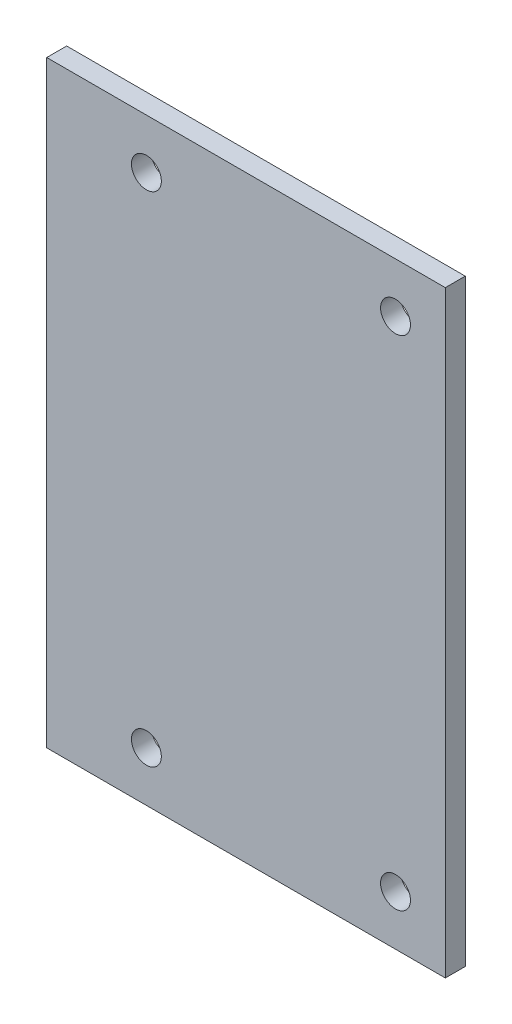
ISO-10303-21;
HEADER;
FILE_DESCRIPTION(('STEP AP214'),'2;1');
FILE_NAME('part.step','',(''),(''),'','','');
FILE_SCHEMA(('AUTOMOTIVE_DESIGN { 1 0 10303 214 1 1 1 1 }'));
ENDSEC;
DATA;
#1=APPLICATION_CONTEXT('core data for automotive mechanical design processes');
#2=APPLICATION_PROTOCOL_DEFINITION('international standard','automotive_design',2000,#1);
#3=PRODUCT_CONTEXT('',#1,'mechanical');
#4=PRODUCT('Part','Part','',(#3));
#5=PRODUCT_RELATED_PRODUCT_CATEGORY('part','',(#4));
#6=PRODUCT_DEFINITION_FORMATION('','',#4);
#7=PRODUCT_DEFINITION_CONTEXT('part definition',#1,'design');
#8=PRODUCT_DEFINITION('design','',#6,#7);
#9=PRODUCT_DEFINITION_SHAPE('','',#8);
#10=(LENGTH_UNIT() NAMED_UNIT(*) SI_UNIT(.MILLI.,.METRE.));
#11=(NAMED_UNIT(*) PLANE_ANGLE_UNIT() SI_UNIT($,.RADIAN.));
#12=(NAMED_UNIT(*) SI_UNIT($,.STERADIAN.) SOLID_ANGLE_UNIT());
#13=UNCERTAINTY_MEASURE_WITH_UNIT(LENGTH_MEASURE(1.E-05),#10,'distance_accuracy_value','');
#14=(GEOMETRIC_REPRESENTATION_CONTEXT(3) GLOBAL_UNCERTAINTY_ASSIGNED_CONTEXT((#13)) GLOBAL_UNIT_ASSIGNED_CONTEXT((#10,
#11,#12)) REPRESENTATION_CONTEXT('',''));
#15=CARTESIAN_POINT('',(0.,0.,0.));
#16=DIRECTION('',(0.,0.,1.));
#17=DIRECTION('',(1.,0.,0.));
#18=AXIS2_PLACEMENT_3D('',#15,#16,#17);
#19=CARTESIAN_POINT('',(0.,0.,2.));
#20=DIRECTION('',(0.,0.,-1.));
#21=DIRECTION('',(-1.,0.,0.));
#22=AXIS2_PLACEMENT_3D('',#19,#20,#21);
#23=PLANE('',#22);
#24=CARTESIAN_POINT('',(10.,4.99999999999999,2.));
#25=DIRECTION('',(0.,0.,1.));
#26=DIRECTION('',(-1.,0.,0.));
#27=AXIS2_PLACEMENT_3D('',#24,#25,#26);
#28=CIRCLE('',#27,1.5);
#29=CARTESIAN_POINT('',(8.5,4.99999999999999,2.));
#30=VERTEX_POINT('',#29);
#31=EDGE_CURVE('E122',#30,#30,#28,.T.);
#32=ORIENTED_EDGE('',*,*,#31,.F.);
#33=EDGE_LOOP('',(#32));
#34=FACE_BOUND('',#33,.T.);
#35=CARTESIAN_POINT('',(10.,55.,2.));
#36=DIRECTION('',(0.,0.,1.));
#37=DIRECTION('',(1.,0.,0.));
#38=AXIS2_PLACEMENT_3D('',#35,#36,#37);
#39=CIRCLE('',#38,1.5);
#40=CARTESIAN_POINT('',(11.5,55.,2.));
#41=VERTEX_POINT('',#40);
#42=EDGE_CURVE('E101',#41,#41,#39,.T.);
#43=ORIENTED_EDGE('',*,*,#42,.F.);
#44=EDGE_LOOP('',(#43));
#45=FACE_BOUND('',#44,.T.);
#46=DIRECTION('',(0.,-1.,0.));
#47=VECTOR('',#46,1.);
#48=CARTESIAN_POINT('',(0.,0.,2.));
#49=LINE('',#48,#47);
#50=CARTESIAN_POINT('',(0.,60.,2.));
#51=VERTEX_POINT('',#50);
#52=CARTESIAN_POINT('',(0.,0.,2.));
#53=VERTEX_POINT('',#52);
#54=EDGE_CURVE('E86',#51,#53,#49,.T.);
#55=ORIENTED_EDGE('',*,*,#54,.T.);
#56=DIRECTION('',(1.,0.,0.));
#57=VECTOR('',#56,1.);
#58=CARTESIAN_POINT('',(0.,0.,2.));
#59=LINE('',#58,#57);
#60=CARTESIAN_POINT('',(40.,0.,2.));
#61=VERTEX_POINT('',#60);
#62=EDGE_CURVE('E81',#53,#61,#59,.T.);
#63=ORIENTED_EDGE('',*,*,#62,.T.);
#64=DIRECTION('',(0.,1.,0.));
#65=VECTOR('',#64,1.);
#66=CARTESIAN_POINT('',(40.,0.,2.));
#67=LINE('',#66,#65);
#68=CARTESIAN_POINT('',(40.,60.,2.));
#69=VERTEX_POINT('',#68);
#70=EDGE_CURVE('E84',#61,#69,#67,.T.);
#71=ORIENTED_EDGE('',*,*,#70,.T.);
#72=DIRECTION('',(-1.,0.,0.));
#73=VECTOR('',#72,1.);
#74=CARTESIAN_POINT('',(0.,60.,2.));
#75=LINE('',#74,#73);
#76=EDGE_CURVE('E51',#69,#51,#75,.T.);
#77=ORIENTED_EDGE('',*,*,#76,.T.);
#78=EDGE_LOOP('',(#55,#63,#71,#77));
#79=FACE_BOUND('',#78,.T.);
#80=CARTESIAN_POINT('',(35.,55.,2.));
#81=DIRECTION('',(0.,0.,1.));
#82=DIRECTION('',(1.,0.,0.));
#83=AXIS2_PLACEMENT_3D('',#80,#81,#82);
#84=CIRCLE('',#83,1.5);
#85=CARTESIAN_POINT('',(36.5,55.,2.));
#86=VERTEX_POINT('',#85);
#87=EDGE_CURVE('E116',#86,#86,#84,.T.);
#88=ORIENTED_EDGE('',*,*,#87,.F.);
#89=EDGE_LOOP('',(#88));
#90=FACE_BOUND('',#89,.T.);
#91=CARTESIAN_POINT('',(35.,4.99999999999999,2.));
#92=DIRECTION('',(0.,0.,1.));
#93=DIRECTION('',(-1.,0.,0.));
#94=AXIS2_PLACEMENT_3D('',#91,#92,#93);
#95=CIRCLE('',#94,1.5);
#96=CARTESIAN_POINT('',(33.5,4.99999999999999,2.));
#97=VERTEX_POINT('',#96);
#98=EDGE_CURVE('E128',#97,#97,#95,.T.);
#99=ORIENTED_EDGE('',*,*,#98,.F.);
#100=EDGE_LOOP('',(#99));
#101=FACE_BOUND('',#100,.T.);
#102=ADVANCED_FACE('F34',(#34,#45,#79,#90,#101),#23,.F.);
#103=CARTESIAN_POINT('',(0.,0.,0.));
#104=DIRECTION('',(0.,0.,-1.));
#105=DIRECTION('',(-1.,0.,0.));
#106=AXIS2_PLACEMENT_3D('',#103,#104,#105);
#107=PLANE('',#106);
#108=CARTESIAN_POINT('',(10.,4.99999999999999,0.));
#109=DIRECTION('',(0.,0.,1.));
#110=DIRECTION('',(-1.,0.,0.));
#111=AXIS2_PLACEMENT_3D('',#108,#109,#110);
#112=CIRCLE('',#111,1.5);
#113=CARTESIAN_POINT('',(8.5,4.99999999999999,0.));
#114=VERTEX_POINT('',#113);
#115=EDGE_CURVE('E125',#114,#114,#112,.T.);
#116=ORIENTED_EDGE('',*,*,#115,.T.);
#117=EDGE_LOOP('',(#116));
#118=FACE_BOUND('',#117,.T.);
#119=CARTESIAN_POINT('',(10.,55.,0.));
#120=DIRECTION('',(0.,0.,1.));
#121=DIRECTION('',(1.,0.,0.));
#122=AXIS2_PLACEMENT_3D('',#119,#120,#121);
#123=CIRCLE('',#122,1.5);
#124=CARTESIAN_POINT('',(11.5,55.,0.));
#125=VERTEX_POINT('',#124);
#126=EDGE_CURVE('E113',#125,#125,#123,.T.);
#127=ORIENTED_EDGE('',*,*,#126,.T.);
#128=EDGE_LOOP('',(#127));
#129=FACE_BOUND('',#128,.T.);
#130=DIRECTION('',(0.,-1.,0.));
#131=VECTOR('',#130,1.);
#132=CARTESIAN_POINT('',(0.,0.,0.));
#133=LINE('',#132,#131);
#134=CARTESIAN_POINT('',(0.,60.,0.));
#135=VERTEX_POINT('',#134);
#136=CARTESIAN_POINT('',(0.,0.,0.));
#137=VERTEX_POINT('',#136);
#138=EDGE_CURVE('E98',#135,#137,#133,.T.);
#139=ORIENTED_EDGE('',*,*,#138,.F.);
#140=DIRECTION('',(-1.,0.,0.));
#141=VECTOR('',#140,1.);
#142=CARTESIAN_POINT('',(0.,60.,0.));
#143=LINE('',#142,#141);
#144=CARTESIAN_POINT('',(40.,60.,0.));
#145=VERTEX_POINT('',#144);
#146=EDGE_CURVE('E74',#145,#135,#143,.T.);
#147=ORIENTED_EDGE('',*,*,#146,.F.);
#148=DIRECTION('',(0.,1.,0.));
#149=VECTOR('',#148,1.);
#150=CARTESIAN_POINT('',(40.,0.,0.));
#151=LINE('',#150,#149);
#152=CARTESIAN_POINT('',(40.,0.,0.));
#153=VERTEX_POINT('',#152);
#154=EDGE_CURVE('E68',#153,#145,#151,.T.);
#155=ORIENTED_EDGE('',*,*,#154,.F.);
#156=DIRECTION('',(1.,0.,0.));
#157=VECTOR('',#156,1.);
#158=CARTESIAN_POINT('',(0.,0.,0.));
#159=LINE('',#158,#157);
#160=EDGE_CURVE('E90',#137,#153,#159,.T.);
#161=ORIENTED_EDGE('',*,*,#160,.F.);
#162=EDGE_LOOP('',(#139,#147,#155,#161));
#163=FACE_BOUND('',#162,.T.);
#164=CARTESIAN_POINT('',(35.,55.,0.));
#165=DIRECTION('',(0.,0.,1.));
#166=DIRECTION('',(1.,0.,0.));
#167=AXIS2_PLACEMENT_3D('',#164,#165,#166);
#168=CIRCLE('',#167,1.5);
#169=CARTESIAN_POINT('',(36.5,55.,0.));
#170=VERTEX_POINT('',#169);
#171=EDGE_CURVE('E119',#170,#170,#168,.T.);
#172=ORIENTED_EDGE('',*,*,#171,.T.);
#173=EDGE_LOOP('',(#172));
#174=FACE_BOUND('',#173,.T.);
#175=CARTESIAN_POINT('',(35.,4.99999999999999,0.));
#176=DIRECTION('',(0.,0.,1.));
#177=DIRECTION('',(-1.,0.,0.));
#178=AXIS2_PLACEMENT_3D('',#175,#176,#177);
#179=CIRCLE('',#178,1.5);
#180=CARTESIAN_POINT('',(33.5,4.99999999999999,0.));
#181=VERTEX_POINT('',#180);
#182=EDGE_CURVE('E131',#181,#181,#179,.T.);
#183=ORIENTED_EDGE('',*,*,#182,.T.);
#184=EDGE_LOOP('',(#183));
#185=FACE_BOUND('',#184,.T.);
#186=ADVANCED_FACE('F109',(#118,#129,#163,#174,#185),#107,.T.);
#187=CARTESIAN_POINT('',(0.,0.,2.));
#188=DIRECTION('',(1.,0.,0.));
#189=DIRECTION('',(0.,0.,-1.));
#190=AXIS2_PLACEMENT_3D('',#187,#188,#189);
#191=PLANE('',#190);
#192=ORIENTED_EDGE('',*,*,#138,.T.);
#193=DIRECTION('',(0.,0.,-1.));
#194=VECTOR('',#193,1.);
#195=CARTESIAN_POINT('',(0.,0.,2.));
#196=LINE('',#195,#194);
#197=EDGE_CURVE('E11',#53,#137,#196,.T.);
#198=ORIENTED_EDGE('',*,*,#197,.F.);
#199=ORIENTED_EDGE('',*,*,#54,.F.);
#200=DIRECTION('',(0.,0.,-1.));
#201=VECTOR('',#200,1.);
#202=CARTESIAN_POINT('',(0.,60.,2.));
#203=LINE('',#202,#201);
#204=EDGE_CURVE('E94',#51,#135,#203,.T.);
#205=ORIENTED_EDGE('',*,*,#204,.T.);
#206=EDGE_LOOP('',(#192,#198,#199,#205));
#207=FACE_BOUND('',#206,.T.);
#208=ADVANCED_FACE('F36',(#207),#191,.F.);
#209=CARTESIAN_POINT('',(0.,0.,2.));
#210=DIRECTION('',(0.,1.,0.));
#211=DIRECTION('',(0.,0.,1.));
#212=AXIS2_PLACEMENT_3D('',#209,#210,#211);
#213=PLANE('',#212);
#214=ORIENTED_EDGE('',*,*,#160,.T.);
#215=DIRECTION('',(0.,0.,-1.));
#216=VECTOR('',#215,1.);
#217=CARTESIAN_POINT('',(40.,0.,2.));
#218=LINE('',#217,#216);
#219=EDGE_CURVE('E43',#61,#153,#218,.T.);
#220=ORIENTED_EDGE('',*,*,#219,.F.);
#221=ORIENTED_EDGE('',*,*,#62,.F.);
#222=ORIENTED_EDGE('',*,*,#197,.T.);
#223=EDGE_LOOP('',(#214,#220,#221,#222));
#224=FACE_BOUND('',#223,.T.);
#225=ADVANCED_FACE('F89',(#224),#213,.F.);
#226=CARTESIAN_POINT('',(40.,0.,2.));
#227=DIRECTION('',(-1.,0.,0.));
#228=DIRECTION('',(0.,0.,1.));
#229=AXIS2_PLACEMENT_3D('',#226,#227,#228);
#230=PLANE('',#229);
#231=ORIENTED_EDGE('',*,*,#154,.T.);
#232=DIRECTION('',(0.,0.,-1.));
#233=VECTOR('',#232,1.);
#234=CARTESIAN_POINT('',(40.,60.,2.));
#235=LINE('',#234,#233);
#236=EDGE_CURVE('E91',#69,#145,#235,.T.);
#237=ORIENTED_EDGE('',*,*,#236,.F.);
#238=ORIENTED_EDGE('',*,*,#70,.F.);
#239=ORIENTED_EDGE('',*,*,#219,.T.);
#240=EDGE_LOOP('',(#231,#237,#238,#239));
#241=FACE_BOUND('',#240,.T.);
#242=ADVANCED_FACE('F92',(#241),#230,.F.);
#243=CARTESIAN_POINT('',(0.,60.,2.));
#244=DIRECTION('',(0.,-1.,0.));
#245=DIRECTION('',(0.,0.,-1.));
#246=AXIS2_PLACEMENT_3D('',#243,#244,#245);
#247=PLANE('',#246);
#248=ORIENTED_EDGE('',*,*,#146,.T.);
#249=ORIENTED_EDGE('',*,*,#204,.F.);
#250=ORIENTED_EDGE('',*,*,#76,.F.);
#251=ORIENTED_EDGE('',*,*,#236,.T.);
#252=EDGE_LOOP('',(#248,#249,#250,#251));
#253=FACE_BOUND('',#252,.T.);
#254=ADVANCED_FACE('F106',(#253),#247,.F.);
#255=CARTESIAN_POINT('',(10.,55.,2.));
#256=DIRECTION('',(0.,0.,-1.));
#257=DIRECTION('',(-1.,0.,0.));
#258=AXIS2_PLACEMENT_3D('',#255,#256,#257);
#259=CYLINDRICAL_SURFACE('',#258,1.5);
#260=ORIENTED_EDGE('',*,*,#42,.T.);
#261=EDGE_LOOP('',(#260));
#262=FACE_BOUND('',#261,.T.);
#263=ORIENTED_EDGE('',*,*,#126,.F.);
#264=EDGE_LOOP('',(#263));
#265=FACE_BOUND('',#264,.T.);
#266=ADVANCED_FACE('F151',(#262,#265),#259,.F.);
#267=CARTESIAN_POINT('',(35.,55.,2.));
#268=DIRECTION('',(0.,0.,-1.));
#269=DIRECTION('',(-1.,0.,0.));
#270=AXIS2_PLACEMENT_3D('',#267,#268,#269);
#271=CYLINDRICAL_SURFACE('',#270,1.5);
#272=ORIENTED_EDGE('',*,*,#87,.T.);
#273=EDGE_LOOP('',(#272));
#274=FACE_BOUND('',#273,.T.);
#275=ORIENTED_EDGE('',*,*,#171,.F.);
#276=EDGE_LOOP('',(#275));
#277=FACE_BOUND('',#276,.T.);
#278=ADVANCED_FACE('F197',(#274,#277),#271,.F.);
#279=CARTESIAN_POINT('',(10.,4.99999999999999,2.));
#280=DIRECTION('',(0.,0.,-1.));
#281=DIRECTION('',(-1.,0.,0.));
#282=AXIS2_PLACEMENT_3D('',#279,#280,#281);
#283=CYLINDRICAL_SURFACE('',#282,1.5);
#284=ORIENTED_EDGE('',*,*,#31,.T.);
#285=EDGE_LOOP('',(#284));
#286=FACE_BOUND('',#285,.T.);
#287=ORIENTED_EDGE('',*,*,#115,.F.);
#288=EDGE_LOOP('',(#287));
#289=FACE_BOUND('',#288,.T.);
#290=ADVANCED_FACE('F205',(#286,#289),#283,.F.);
#291=CARTESIAN_POINT('',(35.,4.99999999999999,2.));
#292=DIRECTION('',(0.,0.,-1.));
#293=DIRECTION('',(-1.,0.,0.));
#294=AXIS2_PLACEMENT_3D('',#291,#292,#293);
#295=CYLINDRICAL_SURFACE('',#294,1.5);
#296=ORIENTED_EDGE('',*,*,#98,.T.);
#297=EDGE_LOOP('',(#296));
#298=FACE_BOUND('',#297,.T.);
#299=ORIENTED_EDGE('',*,*,#182,.F.);
#300=EDGE_LOOP('',(#299));
#301=FACE_BOUND('',#300,.T.);
#302=ADVANCED_FACE('F137',(#298,#301),#295,.F.);
#303=CLOSED_SHELL('',(#102,#186,#208,#225,#242,#254,#266,#278,#290,#302));
#304=MANIFOLD_SOLID_BREP('B2',#303);
#305=ADVANCED_BREP_SHAPE_REPRESENTATION('',(#18,#304),#14);
#306=SHAPE_DEFINITION_REPRESENTATION(#9,#305);
ENDSEC;
END-ISO-10303-21;
